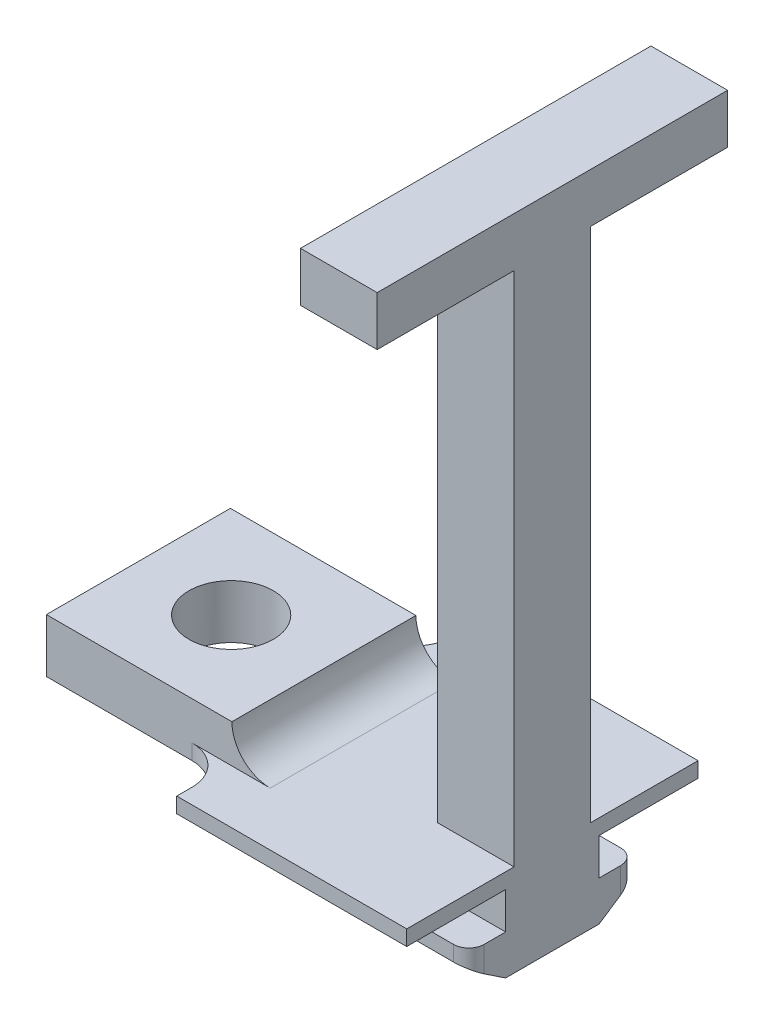
ISO-10303-21;
HEADER;
FILE_DESCRIPTION(('STEP AP214'),'2;1');
FILE_NAME('part.step','',(''),(''),'','','');
FILE_SCHEMA(('AUTOMOTIVE_DESIGN { 1 0 10303 214 1 1 1 1 }'));
ENDSEC;
DATA;
#1=APPLICATION_CONTEXT('core data for automotive mechanical design processes');
#2=APPLICATION_PROTOCOL_DEFINITION('international standard','automotive_design',2000,#1);
#3=PRODUCT_CONTEXT('',#1,'mechanical');
#4=PRODUCT('Part','Part','',(#3));
#5=PRODUCT_RELATED_PRODUCT_CATEGORY('part','',(#4));
#6=PRODUCT_DEFINITION_FORMATION('','',#4);
#7=PRODUCT_DEFINITION_CONTEXT('part definition',#1,'design');
#8=PRODUCT_DEFINITION('design','',#6,#7);
#9=PRODUCT_DEFINITION_SHAPE('','',#8);
#10=(LENGTH_UNIT() NAMED_UNIT(*) SI_UNIT(.MILLI.,.METRE.));
#11=(NAMED_UNIT(*) PLANE_ANGLE_UNIT() SI_UNIT($,.RADIAN.));
#12=(NAMED_UNIT(*) SI_UNIT($,.STERADIAN.) SOLID_ANGLE_UNIT());
#13=UNCERTAINTY_MEASURE_WITH_UNIT(LENGTH_MEASURE(1.E-05),#10,'distance_accuracy_value','');
#14=(GEOMETRIC_REPRESENTATION_CONTEXT(3) GLOBAL_UNCERTAINTY_ASSIGNED_CONTEXT((#13)) GLOBAL_UNIT_ASSIGNED_CONTEXT((#10,
#11,#12)) REPRESENTATION_CONTEXT('',''));
#15=CARTESIAN_POINT('',(0.,0.,0.));
#16=DIRECTION('',(0.,0.,1.));
#17=DIRECTION('',(1.,0.,0.));
#18=AXIS2_PLACEMENT_3D('',#15,#16,#17);
#19=CARTESIAN_POINT('',(-15.,0.,0.));
#20=DIRECTION('',(-1.,0.,0.));
#21=DIRECTION('',(0.,0.,1.));
#22=AXIS2_PLACEMENT_3D('',#19,#20,#21);
#23=PLANE('',#22);
#24=DIRECTION('',(0.,0.,1.));
#25=VECTOR('',#24,1.);
#26=CARTESIAN_POINT('',(-15.,-35.287280409727,9.50000000000001));
#27=LINE('',#26,#25);
#28=CARTESIAN_POINT('',(-15.,-35.287280409727,8.5));
#29=VERTEX_POINT('',#28);
#30=CARTESIAN_POINT('',(-15.,-35.287280409727,9.50000000000001));
#31=VERTEX_POINT('',#30);
#32=EDGE_CURVE('E289',#29,#31,#27,.T.);
#33=ORIENTED_EDGE('',*,*,#32,.F.);
#34=DIRECTION('',(0.,1.,0.));
#35=VECTOR('',#34,1.);
#36=CARTESIAN_POINT('',(-15.,-36.287280409727,8.5));
#37=LINE('',#36,#35);
#38=CARTESIAN_POINT('',(-15.,-36.287280409727,8.5));
#39=VERTEX_POINT('',#38);
#40=EDGE_CURVE('E479',#29,#39,#37,.F.);
#41=ORIENTED_EDGE('',*,*,#40,.T.);
#42=DIRECTION('',(0.,0.,-1.));
#43=VECTOR('',#42,1.);
#44=CARTESIAN_POINT('',(-15.,-36.287280409727,3.05));
#45=LINE('',#44,#43);
#46=CARTESIAN_POINT('',(-15.,-36.287280409727,9.5));
#47=VERTEX_POINT('',#46);
#48=EDGE_CURVE('E292',#47,#39,#45,.T.);
#49=ORIENTED_EDGE('',*,*,#48,.F.);
#50=DIRECTION('',(0.,-1.,0.));
#51=VECTOR('',#50,1.);
#52=CARTESIAN_POINT('',(-15.,-36.287280409727,9.5));
#53=LINE('',#52,#51);
#54=EDGE_CURVE('E288',#31,#47,#53,.T.);
#55=ORIENTED_EDGE('',*,*,#54,.F.);
#56=EDGE_LOOP('',(#33,#41,#49,#55));
#57=FACE_BOUND('',#56,.T.);
#58=ADVANCED_FACE('F35',(#57),#23,.T.);
#59=DIRECTION('',(0.,0.,1.));
#60=VECTOR('',#59,1.);
#61=CARTESIAN_POINT('',(-15.,-36.287280409727,0.));
#62=LINE('',#61,#60);
#63=CARTESIAN_POINT('',(-15.,-36.287280409727,-3.05));
#64=VERTEX_POINT('',#63);
#65=CARTESIAN_POINT('',(-15.,-36.287280409727,3.05));
#66=VERTEX_POINT('',#65);
#67=EDGE_CURVE('E469',#64,#66,#62,.T.);
#68=ORIENTED_EDGE('',*,*,#67,.F.);
#69=DIRECTION('',(0.,1.,0.));
#70=VECTOR('',#69,1.);
#71=CARTESIAN_POINT('',(-15.,-36.287280409727,-3.05));
#72=LINE('',#71,#70);
#73=CARTESIAN_POINT('',(-15.,-38.687280409727,-3.05));
#74=VERTEX_POINT('',#73);
#75=EDGE_CURVE('E319',#74,#64,#72,.T.);
#76=ORIENTED_EDGE('',*,*,#75,.F.);
#77=DIRECTION('',(0.,0.,1.));
#78=VECTOR('',#77,1.);
#79=CARTESIAN_POINT('',(-15.,-38.687280409727,-3.05));
#80=LINE('',#79,#78);
#81=CARTESIAN_POINT('',(-15.,-38.687280409727,-5.45));
#82=VERTEX_POINT('',#81);
#83=EDGE_CURVE('E316',#82,#74,#80,.T.);
#84=ORIENTED_EDGE('',*,*,#83,.F.);
#85=DIRECTION('',(0.,1.,0.));
#86=VECTOR('',#85,1.);
#87=CARTESIAN_POINT('',(-15.,-38.687280409727,-5.45));
#88=LINE('',#87,#86);
#89=CARTESIAN_POINT('',(-15.,-39.687280409727,-5.45));
#90=VERTEX_POINT('',#89);
#91=EDGE_CURVE('E313',#90,#82,#88,.T.);
#92=ORIENTED_EDGE('',*,*,#91,.F.);
#93=DIRECTION('',(0.,0.55470019622523,-0.832050294337843));
#94=VECTOR('',#93,1.);
#95=CARTESIAN_POINT('',(-15.,-39.687280409727,-5.45));
#96=LINE('',#95,#94);
#97=CARTESIAN_POINT('',(-15.,-41.287280409727,-3.05));
#98=VERTEX_POINT('',#97);
#99=EDGE_CURVE('E310',#98,#90,#96,.T.);
#100=ORIENTED_EDGE('',*,*,#99,.F.);
#101=DIRECTION('',(0.,0.,-1.));
#102=VECTOR('',#101,1.);
#103=CARTESIAN_POINT('',(-15.,-41.287280409727,-3.05));
#104=LINE('',#103,#102);
#105=CARTESIAN_POINT('',(-15.,-41.287280409727,3.05));
#106=VERTEX_POINT('',#105);
#107=EDGE_CURVE('E307',#106,#98,#104,.T.);
#108=ORIENTED_EDGE('',*,*,#107,.F.);
#109=DIRECTION('',(0.,-0.554700196225229,-0.832050294337844));
#110=VECTOR('',#109,1.);
#111=CARTESIAN_POINT('',(-15.,-39.687280409727,5.45));
#112=LINE('',#111,#110);
#113=CARTESIAN_POINT('',(-15.,-39.687280409727,5.45));
#114=VERTEX_POINT('',#113);
#115=EDGE_CURVE('E304',#114,#106,#112,.T.);
#116=ORIENTED_EDGE('',*,*,#115,.F.);
#117=DIRECTION('',(0.,-1.,0.));
#118=VECTOR('',#117,1.);
#119=CARTESIAN_POINT('',(-15.,-38.687280409727,5.45));
#120=LINE('',#119,#118);
#121=CARTESIAN_POINT('',(-15.,-38.687280409727,5.45));
#122=VERTEX_POINT('',#121);
#123=EDGE_CURVE('E301',#122,#114,#120,.T.);
#124=ORIENTED_EDGE('',*,*,#123,.F.);
#125=DIRECTION('',(0.,0.,1.));
#126=VECTOR('',#125,1.);
#127=CARTESIAN_POINT('',(-15.,-38.687280409727,3.05));
#128=LINE('',#127,#126);
#129=CARTESIAN_POINT('',(-15.,-38.687280409727,3.05));
#130=VERTEX_POINT('',#129);
#131=EDGE_CURVE('E298',#130,#122,#128,.T.);
#132=ORIENTED_EDGE('',*,*,#131,.F.);
#133=DIRECTION('',(0.,-1.,0.));
#134=VECTOR('',#133,1.);
#135=CARTESIAN_POINT('',(-15.,-36.287280409727,3.05));
#136=LINE('',#135,#134);
#137=EDGE_CURVE('E295',#66,#130,#136,.T.);
#138=ORIENTED_EDGE('',*,*,#137,.F.);
#139=EDGE_LOOP('',(#68,#76,#84,#92,#100,#108,#116,#124,#132,#138));
#140=FACE_BOUND('',#139,.T.);
#141=ADVANCED_FACE('F557',(#140),#23,.T.);
#142=CARTESIAN_POINT('',(-5.,-1.61020370688902,11.4271991646471));
#143=DIRECTION('',(0.,-1.,0.));
#144=DIRECTION('',(0.,0.,-1.));
#145=AXIS2_PLACEMENT_3D('',#142,#143,#144);
#146=PLANE('',#145);
#147=DIRECTION('',(1.,0.,0.));
#148=VECTOR('',#147,1.);
#149=CARTESIAN_POINT('',(-5.,-1.61020370688902,-2.49999999999999));
#150=LINE('',#149,#148);
#151=CARTESIAN_POINT('',(-5.,-1.61020370688902,-2.49999999999999));
#152=VERTEX_POINT('',#151);
#153=CARTESIAN_POINT('',(0.,-1.61020370688902,-2.49999999999999));
#154=VERTEX_POINT('',#153);
#155=EDGE_CURVE('E412',#152,#154,#150,.T.);
#156=ORIENTED_EDGE('',*,*,#155,.F.);
#157=DIRECTION('',(0.,0.,-1.));
#158=VECTOR('',#157,1.);
#159=CARTESIAN_POINT('',(-5.,-1.61020370688902,11.4271991646471));
#160=LINE('',#159,#158);
#161=CARTESIAN_POINT('',(-5.,-1.61020370688902,-11.4271991646471));
#162=VERTEX_POINT('',#161);
#163=EDGE_CURVE('E420',#152,#162,#160,.T.);
#164=ORIENTED_EDGE('',*,*,#163,.T.);
#165=DIRECTION('',(1.,0.,0.));
#166=VECTOR('',#165,1.);
#167=CARTESIAN_POINT('',(-5.,-1.61020370688902,-11.4271991646471));
#168=LINE('',#167,#166);
#169=CARTESIAN_POINT('',(0.,-1.61020370688902,-11.4271991646471));
#170=VERTEX_POINT('',#169);
#171=EDGE_CURVE('E428',#162,#170,#168,.T.);
#172=ORIENTED_EDGE('',*,*,#171,.T.);
#173=DIRECTION('',(0.,0.,-1.));
#174=VECTOR('',#173,1.);
#175=CARTESIAN_POINT('',(0.,-1.61020370688902,11.4271991646471));
#176=LINE('',#175,#174);
#177=EDGE_CURVE('E415',#154,#170,#176,.T.);
#178=ORIENTED_EDGE('',*,*,#177,.F.);
#179=EDGE_LOOP('',(#156,#164,#172,#178));
#180=FACE_BOUND('',#179,.T.);
#181=ADVANCED_FACE('F591',(#180),#146,.T.);
#182=DIRECTION('',(-1.,0.,0.));
#183=VECTOR('',#182,1.);
#184=CARTESIAN_POINT('',(-5.,-1.61020370688902,2.5));
#185=LINE('',#184,#183);
#186=CARTESIAN_POINT('',(0.,-1.61020370688902,2.5));
#187=VERTEX_POINT('',#186);
#188=CARTESIAN_POINT('',(-5.,-1.61020370688902,2.5));
#189=VERTEX_POINT('',#188);
#190=EDGE_CURVE('E407',#187,#189,#185,.T.);
#191=ORIENTED_EDGE('',*,*,#190,.F.);
#192=CARTESIAN_POINT('',(0.,-1.61020370688902,11.4271991646471));
#193=VERTEX_POINT('',#192);
#194=EDGE_CURVE('E429',#193,#187,#176,.T.);
#195=ORIENTED_EDGE('',*,*,#194,.F.);
#196=DIRECTION('',(1.,0.,0.));
#197=VECTOR('',#196,1.);
#198=CARTESIAN_POINT('',(-5.,-1.61020370688902,11.4271991646471));
#199=LINE('',#198,#197);
#200=CARTESIAN_POINT('',(-5.,-1.61020370688902,11.4271991646471));
#201=VERTEX_POINT('',#200);
#202=EDGE_CURVE('E440',#201,#193,#199,.T.);
#203=ORIENTED_EDGE('',*,*,#202,.F.);
#204=EDGE_CURVE('E416',#201,#189,#160,.T.);
#205=ORIENTED_EDGE('',*,*,#204,.T.);
#206=EDGE_LOOP('',(#191,#195,#203,#205));
#207=FACE_BOUND('',#206,.T.);
#208=ADVANCED_FACE('F521',(#207),#146,.T.);
#209=CARTESIAN_POINT('',(-5.,1.61020370688902,11.4271991646471));
#210=DIRECTION('',(0.,0.,1.));
#211=DIRECTION('',(1.,0.,0.));
#212=AXIS2_PLACEMENT_3D('',#209,#210,#211);
#213=PLANE('',#212);
#214=DIRECTION('',(0.,-1.,0.));
#215=VECTOR('',#214,1.);
#216=CARTESIAN_POINT('',(0.,1.61020370688902,11.4271991646471));
#217=LINE('',#216,#215);
#218=CARTESIAN_POINT('',(0.,1.61020370688902,11.4271991646471));
#219=VERTEX_POINT('',#218);
#220=EDGE_CURVE('E437',#219,#193,#217,.T.);
#221=ORIENTED_EDGE('',*,*,#220,.F.);
#222=DIRECTION('',(1.,0.,0.));
#223=VECTOR('',#222,1.);
#224=CARTESIAN_POINT('',(-5.,1.61020370688902,11.4271991646471));
#225=LINE('',#224,#223);
#226=CARTESIAN_POINT('',(-5.,1.61020370688902,11.4271991646471));
#227=VERTEX_POINT('',#226);
#228=EDGE_CURVE('E443',#227,#219,#225,.T.);
#229=ORIENTED_EDGE('',*,*,#228,.F.);
#230=DIRECTION('',(0.,-1.,0.));
#231=VECTOR('',#230,1.);
#232=CARTESIAN_POINT('',(-5.,1.61020370688902,11.4271991646471));
#233=LINE('',#232,#231);
#234=EDGE_CURVE('E425',#227,#201,#233,.T.);
#235=ORIENTED_EDGE('',*,*,#234,.T.);
#236=ORIENTED_EDGE('',*,*,#202,.T.);
#237=EDGE_LOOP('',(#221,#229,#235,#236));
#238=FACE_BOUND('',#237,.T.);
#239=ADVANCED_FACE('F616',(#238),#213,.T.);
#240=CARTESIAN_POINT('',(-5.,1.61020370688902,11.4271991646471));
#241=DIRECTION('',(0.,-1.,0.));
#242=DIRECTION('',(0.,0.,-1.));
#243=AXIS2_PLACEMENT_3D('',#240,#241,#242);
#244=PLANE('',#243);
#245=DIRECTION('',(0.,0.,-1.));
#246=VECTOR('',#245,1.);
#247=CARTESIAN_POINT('',(0.,1.61020370688902,11.4271991646471));
#248=LINE('',#247,#246);
#249=CARTESIAN_POINT('',(0.,1.61020370688902,-11.4271991646471));
#250=VERTEX_POINT('',#249);
#251=EDGE_CURVE('E435',#219,#250,#248,.T.);
#252=ORIENTED_EDGE('',*,*,#251,.T.);
#253=DIRECTION('',(1.,0.,0.));
#254=VECTOR('',#253,1.);
#255=CARTESIAN_POINT('',(-5.,1.61020370688902,-11.4271991646471));
#256=LINE('',#255,#254);
#257=CARTESIAN_POINT('',(-5.,1.61020370688902,-11.4271991646471));
#258=VERTEX_POINT('',#257);
#259=EDGE_CURVE('E445',#258,#250,#256,.T.);
#260=ORIENTED_EDGE('',*,*,#259,.F.);
#261=DIRECTION('',(0.,0.,-1.));
#262=VECTOR('',#261,1.);
#263=CARTESIAN_POINT('',(-5.,1.61020370688902,11.4271991646471));
#264=LINE('',#263,#262);
#265=EDGE_CURVE('E423',#227,#258,#264,.T.);
#266=ORIENTED_EDGE('',*,*,#265,.F.);
#267=ORIENTED_EDGE('',*,*,#228,.T.);
#268=EDGE_LOOP('',(#252,#260,#266,#267));
#269=FACE_BOUND('',#268,.T.);
#270=ADVANCED_FACE('F619',(#269),#244,.F.);
#271=CARTESIAN_POINT('',(-5.,1.61020370688902,-11.4271991646471));
#272=DIRECTION('',(0.,0.,1.));
#273=DIRECTION('',(0.,-1.,0.));
#274=AXIS2_PLACEMENT_3D('',#271,#272,#273);
#275=PLANE('',#274);
#276=DIRECTION('',(0.,-1.,0.));
#277=VECTOR('',#276,1.);
#278=CARTESIAN_POINT('',(0.,1.61020370688902,-11.4271991646471));
#279=LINE('',#278,#277);
#280=EDGE_CURVE('E432',#250,#170,#279,.T.);
#281=ORIENTED_EDGE('',*,*,#280,.T.);
#282=ORIENTED_EDGE('',*,*,#171,.F.);
#283=DIRECTION('',(0.,-1.,0.));
#284=VECTOR('',#283,1.);
#285=CARTESIAN_POINT('',(-5.,1.61020370688902,-11.4271991646471));
#286=LINE('',#285,#284);
#287=EDGE_CURVE('E419',#258,#162,#286,.T.);
#288=ORIENTED_EDGE('',*,*,#287,.F.);
#289=ORIENTED_EDGE('',*,*,#259,.T.);
#290=EDGE_LOOP('',(#281,#282,#288,#289));
#291=FACE_BOUND('',#290,.T.);
#292=ADVANCED_FACE('F613',(#291),#275,.F.);
#293=CARTESIAN_POINT('',(-5.,0.,0.));
#294=DIRECTION('',(-1.,0.,0.));
#295=DIRECTION('',(0.,0.,1.));
#296=AXIS2_PLACEMENT_3D('',#293,#294,#295);
#297=PLANE('',#296);
#298=DIRECTION('',(0.,0.,-1.));
#299=VECTOR('',#298,1.);
#300=CARTESIAN_POINT('',(-5.,-35.287280409727,0.));
#301=LINE('',#300,#299);
#302=CARTESIAN_POINT('',(-5.,-35.287280409727,2.5));
#303=VERTEX_POINT('',#302);
#304=CARTESIAN_POINT('',(-5.,-35.287280409727,-2.5));
#305=VERTEX_POINT('',#304);
#306=EDGE_CURVE('E364',#303,#305,#301,.T.);
#307=ORIENTED_EDGE('',*,*,#306,.F.);
#308=DIRECTION('',(0.,-1.,0.));
#309=VECTOR('',#308,1.);
#310=CARTESIAN_POINT('',(-5.,-36.287280409727,2.5));
#311=LINE('',#310,#309);
#312=EDGE_CURVE('E403',#189,#303,#311,.T.);
#313=ORIENTED_EDGE('',*,*,#312,.F.);
#314=ORIENTED_EDGE('',*,*,#204,.F.);
#315=ORIENTED_EDGE('',*,*,#234,.F.);
#316=ORIENTED_EDGE('',*,*,#265,.T.);
#317=ORIENTED_EDGE('',*,*,#287,.T.);
#318=ORIENTED_EDGE('',*,*,#163,.F.);
#319=DIRECTION('',(0.,1.,0.));
#320=VECTOR('',#319,1.);
#321=CARTESIAN_POINT('',(-5.,-36.287280409727,-2.5));
#322=LINE('',#321,#320);
#323=EDGE_CURVE('E401',#305,#152,#322,.T.);
#324=ORIENTED_EDGE('',*,*,#323,.F.);
#325=EDGE_LOOP('',(#307,#313,#314,#315,#316,#317,#318,#324));
#326=FACE_BOUND('',#325,.T.);
#327=ADVANCED_FACE('F524',(#326),#297,.T.);
#328=CARTESIAN_POINT('',(0.,0.,0.));
#329=DIRECTION('',(-1.,0.,0.));
#330=DIRECTION('',(0.,0.,1.));
#331=AXIS2_PLACEMENT_3D('',#328,#329,#330);
#332=PLANE('',#331);
#333=DIRECTION('',(0.,0.,1.));
#334=VECTOR('',#333,1.);
#335=CARTESIAN_POINT('',(0.,-38.687280409727,3.05));
#336=LINE('',#335,#334);
#337=CARTESIAN_POINT('',(0.,-38.687280409727,3.05));
#338=VERTEX_POINT('',#337);
#339=CARTESIAN_POINT('',(0.,-38.687280409727,4.45));
#340=VERTEX_POINT('',#339);
#341=EDGE_CURVE('E340',#338,#340,#336,.T.);
#342=ORIENTED_EDGE('',*,*,#341,.T.);
#343=DIRECTION('',(0.,-1.,0.));
#344=VECTOR('',#343,1.);
#345=CARTESIAN_POINT('',(0.,-39.687280409727,4.45));
#346=LINE('',#345,#344);
#347=CARTESIAN_POINT('',(0.,-40.3539470763937,4.44999999999999));
#348=VERTEX_POINT('',#347);
#349=EDGE_CURVE('E454',#340,#348,#346,.T.);
#350=ORIENTED_EDGE('',*,*,#349,.T.);
#351=DIRECTION('',(0.,-0.554700196225229,-0.832050294337844));
#352=VECTOR('',#351,1.);
#353=CARTESIAN_POINT('',(0.,-39.687280409727,5.45));
#354=LINE('',#353,#352);
#355=CARTESIAN_POINT('',(0.,-41.287280409727,3.05));
#356=VERTEX_POINT('',#355);
#357=EDGE_CURVE('E343',#348,#356,#354,.T.);
#358=ORIENTED_EDGE('',*,*,#357,.T.);
#359=DIRECTION('',(0.,0.,-1.));
#360=VECTOR('',#359,1.);
#361=CARTESIAN_POINT('',(0.,-41.287280409727,-3.05));
#362=LINE('',#361,#360);
#363=CARTESIAN_POINT('',(0.,-41.287280409727,-3.05));
#364=VERTEX_POINT('',#363);
#365=EDGE_CURVE('E345',#356,#364,#362,.T.);
#366=ORIENTED_EDGE('',*,*,#365,.T.);
#367=DIRECTION('',(0.,0.55470019622523,-0.832050294337843));
#368=VECTOR('',#367,1.);
#369=CARTESIAN_POINT('',(0.,-39.687280409727,-5.45));
#370=LINE('',#369,#368);
#371=CARTESIAN_POINT('',(0.,-40.3539470763937,-4.45));
#372=VERTEX_POINT('',#371);
#373=EDGE_CURVE('E348',#364,#372,#370,.T.);
#374=ORIENTED_EDGE('',*,*,#373,.T.);
#375=DIRECTION('',(0.,1.,0.));
#376=VECTOR('',#375,1.);
#377=CARTESIAN_POINT('',(0.,-38.687280409727,-4.45));
#378=LINE('',#377,#376);
#379=CARTESIAN_POINT('',(0.,-38.687280409727,-4.45));
#380=VERTEX_POINT('',#379);
#381=EDGE_CURVE('E451',#372,#380,#378,.T.);
#382=ORIENTED_EDGE('',*,*,#381,.T.);
#383=DIRECTION('',(0.,0.,1.));
#384=VECTOR('',#383,1.);
#385=CARTESIAN_POINT('',(0.,-38.687280409727,-3.05));
#386=LINE('',#385,#384);
#387=CARTESIAN_POINT('',(0.,-38.687280409727,-3.05));
#388=VERTEX_POINT('',#387);
#389=EDGE_CURVE('E351',#380,#388,#386,.T.);
#390=ORIENTED_EDGE('',*,*,#389,.T.);
#391=DIRECTION('',(0.,1.,0.));
#392=VECTOR('',#391,1.);
#393=CARTESIAN_POINT('',(0.,-36.287280409727,-3.05));
#394=LINE('',#393,#392);
#395=CARTESIAN_POINT('',(0.,-36.287280409727,-3.05));
#396=VERTEX_POINT('',#395);
#397=EDGE_CURVE('E353',#388,#396,#394,.T.);
#398=ORIENTED_EDGE('',*,*,#397,.T.);
#399=DIRECTION('',(0.,0.,-1.));
#400=VECTOR('',#399,1.);
#401=CARTESIAN_POINT('',(0.,-36.287280409727,-3.05));
#402=LINE('',#401,#400);
#403=CARTESIAN_POINT('',(0.,-36.287280409727,-9.5));
#404=VERTEX_POINT('',#403);
#405=EDGE_CURVE('E356',#396,#404,#402,.T.);
#406=ORIENTED_EDGE('',*,*,#405,.T.);
#407=DIRECTION('',(0.,1.,0.));
#408=VECTOR('',#407,1.);
#409=CARTESIAN_POINT('',(0.,-35.287280409727,-9.5));
#410=LINE('',#409,#408);
#411=CARTESIAN_POINT('',(0.,-35.287280409727,-9.5));
#412=VERTEX_POINT('',#411);
#413=EDGE_CURVE('E359',#404,#412,#410,.T.);
#414=ORIENTED_EDGE('',*,*,#413,.T.);
#415=DIRECTION('',(0.,0.,1.));
#416=VECTOR('',#415,1.);
#417=CARTESIAN_POINT('',(0.,-35.287280409727,9.50000000000001));
#418=LINE('',#417,#416);
#419=CARTESIAN_POINT('',(0.,-35.287280409727,-2.5));
#420=VERTEX_POINT('',#419);
#421=EDGE_CURVE('E328',#412,#420,#418,.T.);
#422=ORIENTED_EDGE('',*,*,#421,.T.);
#423=DIRECTION('',(0.,1.,0.));
#424=VECTOR('',#423,1.);
#425=CARTESIAN_POINT('',(0.,-36.287280409727,-2.5));
#426=LINE('',#425,#424);
#427=EDGE_CURVE('E400',#420,#154,#426,.T.);
#428=ORIENTED_EDGE('',*,*,#427,.T.);
#429=ORIENTED_EDGE('',*,*,#177,.T.);
#430=ORIENTED_EDGE('',*,*,#280,.F.);
#431=ORIENTED_EDGE('',*,*,#251,.F.);
#432=ORIENTED_EDGE('',*,*,#220,.T.);
#433=ORIENTED_EDGE('',*,*,#194,.T.);
#434=DIRECTION('',(0.,-1.,0.));
#435=VECTOR('',#434,1.);
#436=CARTESIAN_POINT('',(0.,-36.287280409727,2.5));
#437=LINE('',#436,#435);
#438=CARTESIAN_POINT('',(0.,-35.287280409727,2.5));
#439=VERTEX_POINT('',#438);
#440=EDGE_CURVE('E404',#187,#439,#437,.T.);
#441=ORIENTED_EDGE('',*,*,#440,.T.);
#442=CARTESIAN_POINT('',(0.,-35.287280409727,9.50000000000001));
#443=VERTEX_POINT('',#442);
#444=EDGE_CURVE('E284',#439,#443,#418,.T.);
#445=ORIENTED_EDGE('',*,*,#444,.T.);
#446=DIRECTION('',(0.,-1.,0.));
#447=VECTOR('',#446,1.);
#448=CARTESIAN_POINT('',(0.,-36.287280409727,9.5));
#449=LINE('',#448,#447);
#450=CARTESIAN_POINT('',(0.,-36.287280409727,9.5));
#451=VERTEX_POINT('',#450);
#452=EDGE_CURVE('E331',#443,#451,#449,.T.);
#453=ORIENTED_EDGE('',*,*,#452,.T.);
#454=DIRECTION('',(0.,0.,-1.));
#455=VECTOR('',#454,1.);
#456=CARTESIAN_POINT('',(0.,-36.287280409727,3.05));
#457=LINE('',#456,#455);
#458=CARTESIAN_POINT('',(0.,-36.287280409727,3.05));
#459=VERTEX_POINT('',#458);
#460=EDGE_CURVE('E334',#451,#459,#457,.T.);
#461=ORIENTED_EDGE('',*,*,#460,.T.);
#462=DIRECTION('',(0.,-1.,0.));
#463=VECTOR('',#462,1.);
#464=CARTESIAN_POINT('',(0.,-36.287280409727,3.05));
#465=LINE('',#464,#463);
#466=EDGE_CURVE('E337',#459,#338,#465,.T.);
#467=ORIENTED_EDGE('',*,*,#466,.T.);
#468=EDGE_LOOP('',(#342,#350,#358,#366,#374,#382,#390,#398,#406,#414,#422,#428,#429,#430,#431,
#432,#433,#441,#445,#453,#461,#467));
#469=FACE_BOUND('',#468,.T.);
#470=ADVANCED_FACE('F516',(#469),#332,.F.);
#471=CARTESIAN_POINT('',(-5.,-36.287280409727,-2.5));
#472=DIRECTION('',(0.,0.,-1.));
#473=DIRECTION('',(0.,1.,0.));
#474=AXIS2_PLACEMENT_3D('',#471,#472,#473);
#475=PLANE('',#474);
#476=DIRECTION('',(1.,0.,0.));
#477=VECTOR('',#476,1.);
#478=CARTESIAN_POINT('',(-5.,-35.287280409727,-2.5));
#479=LINE('',#478,#477);
#480=EDGE_CURVE('E398',#305,#420,#479,.T.);
#481=ORIENTED_EDGE('',*,*,#480,.F.);
#482=ORIENTED_EDGE('',*,*,#323,.T.);
#483=ORIENTED_EDGE('',*,*,#155,.T.);
#484=ORIENTED_EDGE('',*,*,#427,.F.);
#485=EDGE_LOOP('',(#481,#482,#483,#484));
#486=FACE_BOUND('',#485,.T.);
#487=ADVANCED_FACE('F532',(#486),#475,.T.);
#488=CARTESIAN_POINT('',(-5.,-36.287280409727,2.5));
#489=DIRECTION('',(0.,0.,1.));
#490=DIRECTION('',(0.,-1.,0.));
#491=AXIS2_PLACEMENT_3D('',#488,#489,#490);
#492=PLANE('',#491);
#493=DIRECTION('',(-1.,0.,0.));
#494=VECTOR('',#493,1.);
#495=CARTESIAN_POINT('',(-5.,-35.287280409727,2.5));
#496=LINE('',#495,#494);
#497=EDGE_CURVE('E442',#439,#303,#496,.T.);
#498=ORIENTED_EDGE('',*,*,#497,.F.);
#499=ORIENTED_EDGE('',*,*,#440,.F.);
#500=ORIENTED_EDGE('',*,*,#190,.T.);
#501=ORIENTED_EDGE('',*,*,#312,.T.);
#502=EDGE_LOOP('',(#498,#499,#500,#501));
#503=FACE_BOUND('',#502,.T.);
#504=ADVANCED_FACE('F513',(#503),#492,.T.);
#505=CARTESIAN_POINT('',(-15.,-35.287280409727,9.50000000000001));
#506=DIRECTION('',(0.,1.,0.));
#507=DIRECTION('',(0.,0.,1.));
#508=AXIS2_PLACEMENT_3D('',#505,#506,#507);
#509=PLANE('',#508);
#510=DIRECTION('',(0.,0.,1.));
#511=VECTOR('',#510,1.);
#512=CARTESIAN_POINT('',(-12.4,-35.287280409727,9.50000000000001));
#513=LINE('',#512,#511);
#514=CARTESIAN_POINT('',(-12.4,-35.287280409727,-6.));
#515=VERTEX_POINT('',#514);
#516=CARTESIAN_POINT('',(-12.4,-35.287280409727,6.));
#517=VERTEX_POINT('',#516);
#518=EDGE_CURVE('E481',#515,#517,#513,.T.);
#519=ORIENTED_EDGE('',*,*,#518,.T.);
#520=DIRECTION('',(1.,0.,0.));
#521=VECTOR('',#520,1.);
#522=CARTESIAN_POINT('',(-15.,-35.287280409727,6.));
#523=LINE('',#522,#521);
#524=CARTESIAN_POINT('',(-17.5,-35.287280409727,6.));
#525=VERTEX_POINT('',#524);
#526=EDGE_CURVE('E50',#525,#517,#523,.T.);
#527=ORIENTED_EDGE('',*,*,#526,.F.);
#528=CARTESIAN_POINT('',(-17.5,-35.287280409727,8.5));
#529=DIRECTION('',(0.,1.,0.));
#530=DIRECTION('',(0.,0.,1.));
#531=AXIS2_PLACEMENT_3D('',#528,#529,#530);
#532=CIRCLE('',#531,2.5);
#533=EDGE_CURVE('E487',#525,#29,#532,.F.);
#534=ORIENTED_EDGE('',*,*,#533,.T.);
#535=ORIENTED_EDGE('',*,*,#32,.T.);
#536=DIRECTION('',(1.,0.,0.));
#537=VECTOR('',#536,1.);
#538=CARTESIAN_POINT('',(-15.,-35.287280409727,9.50000000000001));
#539=LINE('',#538,#537);
#540=EDGE_CURVE('E327',#31,#443,#539,.T.);
#541=ORIENTED_EDGE('',*,*,#540,.T.);
#542=ORIENTED_EDGE('',*,*,#444,.F.);
#543=ORIENTED_EDGE('',*,*,#497,.T.);
#544=ORIENTED_EDGE('',*,*,#306,.T.);
#545=ORIENTED_EDGE('',*,*,#480,.T.);
#546=ORIENTED_EDGE('',*,*,#421,.F.);
#547=DIRECTION('',(1.,0.,0.));
#548=VECTOR('',#547,1.);
#549=CARTESIAN_POINT('',(-15.,-35.287280409727,-9.5));
#550=LINE('',#549,#548);
#551=CARTESIAN_POINT('',(-15.,-35.287280409727,-9.5));
#552=VERTEX_POINT('',#551);
#553=EDGE_CURVE('E362',#552,#412,#550,.T.);
#554=ORIENTED_EDGE('',*,*,#553,.F.);
#555=CARTESIAN_POINT('',(-15.,-35.287280409727,-8.5));
#556=VERTEX_POINT('',#555);
#557=EDGE_CURVE('E285',#552,#556,#27,.T.);
#558=ORIENTED_EDGE('',*,*,#557,.T.);
#559=CARTESIAN_POINT('',(-17.5,-35.287280409727,-8.5));
#560=DIRECTION('',(0.,1.,0.));
#561=DIRECTION('',(0.,0.,1.));
#562=AXIS2_PLACEMENT_3D('',#559,#560,#561);
#563=CIRCLE('',#562,2.5);
#564=CARTESIAN_POINT('',(-17.5,-35.287280409727,-6.));
#565=VERTEX_POINT('',#564);
#566=EDGE_CURVE('E485',#556,#565,#563,.F.);
#567=ORIENTED_EDGE('',*,*,#566,.T.);
#568=DIRECTION('',(-1.,0.,0.));
#569=VECTOR('',#568,1.);
#570=CARTESIAN_POINT('',(-15.,-35.287280409727,-6.));
#571=LINE('',#570,#569);
#572=EDGE_CURVE('E58',#515,#565,#571,.T.);
#573=ORIENTED_EDGE('',*,*,#572,.F.);
#574=EDGE_LOOP('',(#519,#527,#534,#535,#541,#542,#543,#544,#545,#546,#554,#558,#567,#573));
#575=FACE_BOUND('',#574,.T.);
#576=ADVANCED_FACE('F501',(#575),#509,.T.);
#577=CARTESIAN_POINT('',(-15.,-35.287280409727,-9.5));
#578=DIRECTION('',(0.,0.,-1.));
#579=DIRECTION('',(-1.,0.,0.));
#580=AXIS2_PLACEMENT_3D('',#577,#578,#579);
#581=PLANE('',#580);
#582=ORIENTED_EDGE('',*,*,#413,.F.);
#583=DIRECTION('',(1.,0.,0.));
#584=VECTOR('',#583,1.);
#585=CARTESIAN_POINT('',(-15.,-36.287280409727,-9.5));
#586=LINE('',#585,#584);
#587=CARTESIAN_POINT('',(-15.,-36.287280409727,-9.5));
#588=VERTEX_POINT('',#587);
#589=EDGE_CURVE('E365',#588,#404,#586,.T.);
#590=ORIENTED_EDGE('',*,*,#589,.F.);
#591=DIRECTION('',(0.,1.,0.));
#592=VECTOR('',#591,1.);
#593=CARTESIAN_POINT('',(-15.,-35.287280409727,-9.5));
#594=LINE('',#593,#592);
#595=EDGE_CURVE('E324',#588,#552,#594,.T.);
#596=ORIENTED_EDGE('',*,*,#595,.T.);
#597=ORIENTED_EDGE('',*,*,#553,.T.);
#598=EDGE_LOOP('',(#582,#590,#596,#597));
#599=FACE_BOUND('',#598,.T.);
#600=ADVANCED_FACE('F546',(#599),#581,.T.);
#601=CARTESIAN_POINT('',(-15.,-36.287280409727,-3.05));
#602=DIRECTION('',(0.,-1.,0.));
#603=DIRECTION('',(0.,0.,-1.));
#604=AXIS2_PLACEMENT_3D('',#601,#602,#603);
#605=PLANE('',#604);
#606=CARTESIAN_POINT('',(-20.95,-36.287280409727,0.));
#607=DIRECTION('',(0.,-1.,0.));
#608=DIRECTION('',(0.,0.,-1.));
#609=AXIS2_PLACEMENT_3D('',#606,#607,#608);
#610=CIRCLE('',#609,2.75);
#611=CARTESIAN_POINT('',(-20.95,-36.287280409727,-2.74999999999999));
#612=VERTEX_POINT('',#611);
#613=EDGE_CURVE('E270',#612,#612,#610,.F.);
#614=ORIENTED_EDGE('',*,*,#613,.T.);
#615=EDGE_LOOP('',(#614));
#616=FACE_BOUND('',#615,.T.);
#617=DIRECTION('',(-1.,0.,0.));
#618=VECTOR('',#617,1.);
#619=CARTESIAN_POINT('',(-14.9,-36.287280409727,-6.));
#620=LINE('',#619,#618);
#621=CARTESIAN_POINT('',(-17.5,-36.287280409727,-6.));
#622=VERTEX_POINT('',#621);
#623=CARTESIAN_POINT('',(-27.,-36.287280409727,-6.));
#624=VERTEX_POINT('',#623);
#625=EDGE_CURVE('E279',#622,#624,#620,.T.);
#626=ORIENTED_EDGE('',*,*,#625,.F.);
#627=CARTESIAN_POINT('',(-17.5,-36.287280409727,-8.5));
#628=DIRECTION('',(0.,-1.,0.));
#629=DIRECTION('',(0.,0.,-1.));
#630=AXIS2_PLACEMENT_3D('',#627,#628,#629);
#631=CIRCLE('',#630,2.5);
#632=CARTESIAN_POINT('',(-15.,-36.287280409727,-8.5));
#633=VERTEX_POINT('',#632);
#634=EDGE_CURVE('E483',#622,#633,#631,.F.);
#635=ORIENTED_EDGE('',*,*,#634,.T.);
#636=DIRECTION('',(0.,0.,-1.));
#637=VECTOR('',#636,1.);
#638=CARTESIAN_POINT('',(-15.,-36.287280409727,-3.05));
#639=LINE('',#638,#637);
#640=EDGE_CURVE('E322',#633,#588,#639,.T.);
#641=ORIENTED_EDGE('',*,*,#640,.T.);
#642=ORIENTED_EDGE('',*,*,#589,.T.);
#643=ORIENTED_EDGE('',*,*,#405,.F.);
#644=DIRECTION('',(1.,0.,0.));
#645=VECTOR('',#644,1.);
#646=CARTESIAN_POINT('',(-15.,-36.287280409727,-3.05));
#647=LINE('',#646,#645);
#648=EDGE_CURVE('E367',#64,#396,#647,.T.);
#649=ORIENTED_EDGE('',*,*,#648,.F.);
#650=ORIENTED_EDGE('',*,*,#67,.T.);
#651=DIRECTION('',(1.,0.,0.));
#652=VECTOR('',#651,1.);
#653=CARTESIAN_POINT('',(-15.,-36.287280409727,3.05));
#654=LINE('',#653,#652);
#655=EDGE_CURVE('E391',#66,#459,#654,.T.);
#656=ORIENTED_EDGE('',*,*,#655,.T.);
#657=ORIENTED_EDGE('',*,*,#460,.F.);
#658=DIRECTION('',(1.,0.,0.));
#659=VECTOR('',#658,1.);
#660=CARTESIAN_POINT('',(-15.,-36.287280409727,9.5));
#661=LINE('',#660,#659);
#662=EDGE_CURVE('E393',#47,#451,#661,.T.);
#663=ORIENTED_EDGE('',*,*,#662,.F.);
#664=ORIENTED_EDGE('',*,*,#48,.T.);
#665=CARTESIAN_POINT('',(-17.5,-36.287280409727,8.5));
#666=DIRECTION('',(0.,-1.,0.));
#667=DIRECTION('',(0.,0.,-1.));
#668=AXIS2_PLACEMENT_3D('',#665,#666,#667);
#669=CIRCLE('',#668,2.5);
#670=CARTESIAN_POINT('',(-17.5,-36.287280409727,6.));
#671=VERTEX_POINT('',#670);
#672=EDGE_CURVE('E489',#39,#671,#669,.F.);
#673=ORIENTED_EDGE('',*,*,#672,.T.);
#674=DIRECTION('',(-1.,0.,0.));
#675=VECTOR('',#674,1.);
#676=CARTESIAN_POINT('',(-14.9,-36.287280409727,6.));
#677=LINE('',#676,#675);
#678=CARTESIAN_POINT('',(-27.,-36.287280409727,6.));
#679=VERTEX_POINT('',#678);
#680=EDGE_CURVE('E277',#671,#679,#677,.T.);
#681=ORIENTED_EDGE('',*,*,#680,.T.);
#682=DIRECTION('',(0.,0.,1.));
#683=VECTOR('',#682,1.);
#684=CARTESIAN_POINT('',(-27.,-36.287280409727,-6.));
#685=LINE('',#684,#683);
#686=EDGE_CURVE('E266',#624,#679,#685,.T.);
#687=ORIENTED_EDGE('',*,*,#686,.F.);
#688=EDGE_LOOP('',(#626,#635,#641,#642,#643,#649,#650,#656,#657,#663,#664,#673,#681,#687));
#689=FACE_BOUND('',#688,.T.);
#690=ADVANCED_FACE('F493',(#616,#689),#605,.T.);
#691=CARTESIAN_POINT('',(-15.,-36.287280409727,-3.05));
#692=DIRECTION('',(0.,0.,-1.));
#693=DIRECTION('',(0.,1.,0.));
#694=AXIS2_PLACEMENT_3D('',#691,#692,#693);
#695=PLANE('',#694);
#696=ORIENTED_EDGE('',*,*,#397,.F.);
#697=DIRECTION('',(1.,0.,0.));
#698=VECTOR('',#697,1.);
#699=CARTESIAN_POINT('',(-15.,-38.687280409727,-3.05));
#700=LINE('',#699,#698);
#701=EDGE_CURVE('E369',#74,#388,#700,.T.);
#702=ORIENTED_EDGE('',*,*,#701,.F.);
#703=ORIENTED_EDGE('',*,*,#75,.T.);
#704=ORIENTED_EDGE('',*,*,#648,.T.);
#705=EDGE_LOOP('',(#696,#702,#703,#704));
#706=FACE_BOUND('',#705,.T.);
#707=ADVANCED_FACE('F552',(#706),#695,.T.);
#708=CARTESIAN_POINT('',(-15.,-38.687280409727,-3.05));
#709=DIRECTION('',(0.,1.,0.));
#710=DIRECTION('',(0.,0.,1.));
#711=AXIS2_PLACEMENT_3D('',#708,#709,#710);
#712=PLANE('',#711);
#713=ORIENTED_EDGE('',*,*,#389,.F.);
#714=CARTESIAN_POINT('',(-1.,-38.687280409727,-4.45));
#715=DIRECTION('',(0.,1.,0.));
#716=DIRECTION('',(0.,0.,1.));
#717=AXIS2_PLACEMENT_3D('',#714,#715,#716);
#718=CIRCLE('',#717,1.);
#719=CARTESIAN_POINT('',(-1.,-38.687280409727,-5.45));
#720=VERTEX_POINT('',#719);
#721=EDGE_CURVE('E463',#380,#720,#718,.T.);
#722=ORIENTED_EDGE('',*,*,#721,.T.);
#723=DIRECTION('',(1.,0.,0.));
#724=VECTOR('',#723,1.);
#725=CARTESIAN_POINT('',(-15.,-38.687280409727,-5.45));
#726=LINE('',#725,#724);
#727=EDGE_CURVE('E372',#82,#720,#726,.T.);
#728=ORIENTED_EDGE('',*,*,#727,.F.);
#729=ORIENTED_EDGE('',*,*,#83,.T.);
#730=ORIENTED_EDGE('',*,*,#701,.T.);
#731=EDGE_LOOP('',(#713,#722,#728,#729,#730));
#732=FACE_BOUND('',#731,.T.);
#733=ADVANCED_FACE('F674',(#732),#712,.T.);
#734=CARTESIAN_POINT('',(-15.,-38.687280409727,-5.45));
#735=DIRECTION('',(0.,0.,-1.));
#736=DIRECTION('',(0.,1.,0.));
#737=AXIS2_PLACEMENT_3D('',#734,#735,#736);
#738=PLANE('',#737);
#739=ORIENTED_EDGE('',*,*,#727,.T.);
#740=DIRECTION('',(0.,1.,0.));
#741=VECTOR('',#740,1.);
#742=CARTESIAN_POINT('',(-1.,-39.687280409727,-5.45));
#743=LINE('',#742,#741);
#744=CARTESIAN_POINT('',(-1.,-39.687280409727,-5.45));
#745=VERTEX_POINT('',#744);
#746=EDGE_CURVE('E465',#720,#745,#743,.F.);
#747=ORIENTED_EDGE('',*,*,#746,.T.);
#748=DIRECTION('',(1.,0.,0.));
#749=VECTOR('',#748,1.);
#750=CARTESIAN_POINT('',(-15.,-39.687280409727,-5.45));
#751=LINE('',#750,#749);
#752=EDGE_CURVE('E375',#90,#745,#751,.T.);
#753=ORIENTED_EDGE('',*,*,#752,.F.);
#754=ORIENTED_EDGE('',*,*,#91,.T.);
#755=EDGE_LOOP('',(#739,#747,#753,#754));
#756=FACE_BOUND('',#755,.T.);
#757=ADVANCED_FACE('F679',(#756),#738,.T.);
#758=CARTESIAN_POINT('',(-15.,-39.687280409727,-5.45));
#759=DIRECTION('',(0.,-0.832050294337843,-0.55470019622523));
#760=DIRECTION('',(0.,0.55470019622523,-0.832050294337843));
#761=AXIS2_PLACEMENT_3D('',#758,#759,#760);
#762=PLANE('',#761);
#763=ORIENTED_EDGE('',*,*,#752,.T.);
#764=CARTESIAN_POINT('',(-1.,-40.3539470763937,-4.45));
#765=DIRECTION('',(0.,-0.832050294337843,-0.55470019622523));
#766=DIRECTION('',(0.,-0.55470019622523,0.832050294337843));
#767=AXIS2_PLACEMENT_3D('',#764,#765,#766);
#768=ELLIPSE('',#767,1.20185042515467,1.);
#769=EDGE_CURVE('E467',#745,#372,#768,.T.);
#770=ORIENTED_EDGE('',*,*,#769,.T.);
#771=ORIENTED_EDGE('',*,*,#373,.F.);
#772=DIRECTION('',(1.,0.,0.));
#773=VECTOR('',#772,1.);
#774=CARTESIAN_POINT('',(-15.,-41.287280409727,-3.05));
#775=LINE('',#774,#773);
#776=EDGE_CURVE('E378',#98,#364,#775,.T.);
#777=ORIENTED_EDGE('',*,*,#776,.F.);
#778=ORIENTED_EDGE('',*,*,#99,.T.);
#779=EDGE_LOOP('',(#763,#770,#771,#777,#778));
#780=FACE_BOUND('',#779,.T.);
#781=ADVANCED_FACE('F683',(#780),#762,.T.);
#782=CARTESIAN_POINT('',(-15.,-41.287280409727,-3.05));
#783=DIRECTION('',(0.,-1.,0.));
#784=DIRECTION('',(0.,0.,-1.));
#785=AXIS2_PLACEMENT_3D('',#782,#783,#784);
#786=PLANE('',#785);
#787=ORIENTED_EDGE('',*,*,#365,.F.);
#788=DIRECTION('',(1.,0.,0.));
#789=VECTOR('',#788,1.);
#790=CARTESIAN_POINT('',(-15.,-41.287280409727,3.05));
#791=LINE('',#790,#789);
#792=EDGE_CURVE('E380',#106,#356,#791,.T.);
#793=ORIENTED_EDGE('',*,*,#792,.F.);
#794=ORIENTED_EDGE('',*,*,#107,.T.);
#795=ORIENTED_EDGE('',*,*,#776,.T.);
#796=EDGE_LOOP('',(#787,#793,#794,#795));
#797=FACE_BOUND('',#796,.T.);
#798=ADVANCED_FACE('F687',(#797),#786,.T.);
#799=CARTESIAN_POINT('',(-15.,-39.687280409727,5.45));
#800=DIRECTION('',(0.,-0.832050294337844,0.554700196225229));
#801=DIRECTION('',(0.,-0.554700196225229,-0.832050294337844));
#802=AXIS2_PLACEMENT_3D('',#799,#800,#801);
#803=PLANE('',#802);
#804=ORIENTED_EDGE('',*,*,#357,.F.);
#805=CARTESIAN_POINT('',(-1.,-40.3539470763937,4.44999999999999));
#806=DIRECTION('',(0.,-0.832050294337844,0.554700196225229));
#807=DIRECTION('',(0.,0.554700196225229,0.832050294337844));
#808=AXIS2_PLACEMENT_3D('',#805,#806,#807);
#809=ELLIPSE('',#808,1.20185042515467,1.);
#810=CARTESIAN_POINT('',(-1.,-39.687280409727,5.45));
#811=VERTEX_POINT('',#810);
#812=EDGE_CURVE('E457',#348,#811,#809,.T.);
#813=ORIENTED_EDGE('',*,*,#812,.T.);
#814=DIRECTION('',(1.,0.,0.));
#815=VECTOR('',#814,1.);
#816=CARTESIAN_POINT('',(-15.,-39.687280409727,5.45));
#817=LINE('',#816,#815);
#818=EDGE_CURVE('E383',#114,#811,#817,.T.);
#819=ORIENTED_EDGE('',*,*,#818,.F.);
#820=ORIENTED_EDGE('',*,*,#115,.T.);
#821=ORIENTED_EDGE('',*,*,#792,.T.);
#822=EDGE_LOOP('',(#804,#813,#819,#820,#821));
#823=FACE_BOUND('',#822,.T.);
#824=ADVANCED_FACE('F572',(#823),#803,.T.);
#825=CARTESIAN_POINT('',(-15.,-38.687280409727,5.45));
#826=DIRECTION('',(0.,0.,1.));
#827=DIRECTION('',(0.,-1.,0.));
#828=AXIS2_PLACEMENT_3D('',#825,#826,#827);
#829=PLANE('',#828);
#830=ORIENTED_EDGE('',*,*,#818,.T.);
#831=DIRECTION('',(0.,-1.,0.));
#832=VECTOR('',#831,1.);
#833=CARTESIAN_POINT('',(-1.,-38.687280409727,5.45));
#834=LINE('',#833,#832);
#835=CARTESIAN_POINT('',(-1.,-38.687280409727,5.45));
#836=VERTEX_POINT('',#835);
#837=EDGE_CURVE('E459',#811,#836,#834,.F.);
#838=ORIENTED_EDGE('',*,*,#837,.T.);
#839=DIRECTION('',(1.,0.,0.));
#840=VECTOR('',#839,1.);
#841=CARTESIAN_POINT('',(-15.,-38.687280409727,5.45));
#842=LINE('',#841,#840);
#843=EDGE_CURVE('E386',#122,#836,#842,.T.);
#844=ORIENTED_EDGE('',*,*,#843,.F.);
#845=ORIENTED_EDGE('',*,*,#123,.T.);
#846=EDGE_LOOP('',(#830,#838,#844,#845));
#847=FACE_BOUND('',#846,.T.);
#848=ADVANCED_FACE('F575',(#847),#829,.T.);
#849=CARTESIAN_POINT('',(-15.,-38.687280409727,3.05));
#850=DIRECTION('',(0.,1.,0.));
#851=DIRECTION('',(0.,0.,1.));
#852=AXIS2_PLACEMENT_3D('',#849,#850,#851);
#853=PLANE('',#852);
#854=ORIENTED_EDGE('',*,*,#843,.T.);
#855=CARTESIAN_POINT('',(-1.,-38.687280409727,4.45));
#856=DIRECTION('',(0.,1.,0.));
#857=DIRECTION('',(0.,0.,1.));
#858=AXIS2_PLACEMENT_3D('',#855,#856,#857);
#859=CIRCLE('',#858,1.);
#860=EDGE_CURVE('E461',#836,#340,#859,.T.);
#861=ORIENTED_EDGE('',*,*,#860,.T.);
#862=ORIENTED_EDGE('',*,*,#341,.F.);
#863=DIRECTION('',(1.,0.,0.));
#864=VECTOR('',#863,1.);
#865=CARTESIAN_POINT('',(-15.,-38.687280409727,3.05));
#866=LINE('',#865,#864);
#867=EDGE_CURVE('E389',#130,#338,#866,.T.);
#868=ORIENTED_EDGE('',*,*,#867,.F.);
#869=ORIENTED_EDGE('',*,*,#131,.T.);
#870=EDGE_LOOP('',(#854,#861,#862,#868,#869));
#871=FACE_BOUND('',#870,.T.);
#872=ADVANCED_FACE('F577',(#871),#853,.T.);
#873=CARTESIAN_POINT('',(-15.,-36.287280409727,3.05));
#874=DIRECTION('',(0.,0.,1.));
#875=DIRECTION('',(0.,-1.,0.));
#876=AXIS2_PLACEMENT_3D('',#873,#874,#875);
#877=PLANE('',#876);
#878=ORIENTED_EDGE('',*,*,#466,.F.);
#879=ORIENTED_EDGE('',*,*,#655,.F.);
#880=ORIENTED_EDGE('',*,*,#137,.T.);
#881=ORIENTED_EDGE('',*,*,#867,.T.);
#882=EDGE_LOOP('',(#878,#879,#880,#881));
#883=FACE_BOUND('',#882,.T.);
#884=ADVANCED_FACE('F562',(#883),#877,.T.);
#885=CARTESIAN_POINT('',(-15.,-36.287280409727,9.5));
#886=DIRECTION('',(0.,0.,1.));
#887=DIRECTION('',(0.,-1.,0.));
#888=AXIS2_PLACEMENT_3D('',#885,#886,#887);
#889=PLANE('',#888);
#890=ORIENTED_EDGE('',*,*,#452,.F.);
#891=ORIENTED_EDGE('',*,*,#540,.F.);
#892=ORIENTED_EDGE('',*,*,#54,.T.);
#893=ORIENTED_EDGE('',*,*,#662,.T.);
#894=EDGE_LOOP('',(#890,#891,#892,#893));
#895=FACE_BOUND('',#894,.T.);
#896=ADVANCED_FACE('F507',(#895),#889,.T.);
#897=ORIENTED_EDGE('',*,*,#640,.F.);
#898=DIRECTION('',(0.,-1.,0.));
#899=VECTOR('',#898,1.);
#900=CARTESIAN_POINT('',(-15.,-35.287280409727,-8.5));
#901=LINE('',#900,#899);
#902=EDGE_CURVE('E475',#633,#556,#901,.F.);
#903=ORIENTED_EDGE('',*,*,#902,.T.);
#904=ORIENTED_EDGE('',*,*,#557,.F.);
#905=ORIENTED_EDGE('',*,*,#595,.F.);
#906=EDGE_LOOP('',(#897,#903,#904,#905));
#907=FACE_BOUND('',#906,.T.);
#908=ADVANCED_FACE('F543',(#907),#23,.T.);
#909=CARTESIAN_POINT('',(-1.,0.,4.45000000000013));
#910=DIRECTION('',(0.,1.,0.));
#911=DIRECTION('',(0.,0.,1.));
#912=AXIS2_PLACEMENT_3D('',#909,#910,#911);
#913=CYLINDRICAL_SURFACE('',#912,1.);
#914=ORIENTED_EDGE('',*,*,#860,.F.);
#915=ORIENTED_EDGE('',*,*,#837,.F.);
#916=ORIENTED_EDGE('',*,*,#812,.F.);
#917=ORIENTED_EDGE('',*,*,#349,.F.);
#918=EDGE_LOOP('',(#914,#915,#916,#917));
#919=FACE_BOUND('',#918,.T.);
#920=ADVANCED_FACE('F569',(#919),#913,.T.);
#921=CARTESIAN_POINT('',(-1.,0.,-4.45000000000003));
#922=DIRECTION('',(0.,-1.,0.));
#923=DIRECTION('',(0.,0.,-1.));
#924=AXIS2_PLACEMENT_3D('',#921,#922,#923);
#925=CYLINDRICAL_SURFACE('',#924,1.);
#926=ORIENTED_EDGE('',*,*,#769,.F.);
#927=ORIENTED_EDGE('',*,*,#746,.F.);
#928=ORIENTED_EDGE('',*,*,#721,.F.);
#929=ORIENTED_EDGE('',*,*,#381,.F.);
#930=EDGE_LOOP('',(#926,#927,#928,#929));
#931=FACE_BOUND('',#930,.T.);
#932=ADVANCED_FACE('F599',(#931),#925,.T.);
#933=CARTESIAN_POINT('',(-14.9,-32.787280409727,6.));
#934=DIRECTION('',(0.,0.,1.));
#935=DIRECTION('',(1.,0.,0.));
#936=AXIS2_PLACEMENT_3D('',#933,#934,#935);
#937=PLANE('',#936);
#938=ORIENTED_EDGE('',*,*,#680,.F.);
#939=DIRECTION('',(0.,1.,0.));
#940=VECTOR('',#939,1.);
#941=CARTESIAN_POINT('',(-17.5,-35.287280409727,6.));
#942=LINE('',#941,#940);
#943=EDGE_CURVE('E477',#671,#525,#942,.T.);
#944=ORIENTED_EDGE('',*,*,#943,.T.);
#945=ORIENTED_EDGE('',*,*,#526,.T.);
#946=CARTESIAN_POINT('',(-12.4,-32.787280409727,6.));
#947=DIRECTION('',(0.,0.,1.));
#948=DIRECTION('',(1.,0.,0.));
#949=AXIS2_PLACEMENT_3D('',#946,#947,#948);
#950=CIRCLE('',#949,2.5);
#951=CARTESIAN_POINT('',(-14.9,-32.787280409727,6.));
#952=VERTEX_POINT('',#951);
#953=EDGE_CURVE('E43',#517,#952,#950,.F.);
#954=ORIENTED_EDGE('',*,*,#953,.T.);
#955=DIRECTION('',(-1.,0.,0.));
#956=VECTOR('',#955,1.);
#957=CARTESIAN_POINT('',(-14.9,-32.787280409727,6.));
#958=LINE('',#957,#956);
#959=CARTESIAN_POINT('',(-27.,-32.787280409727,6.));
#960=VERTEX_POINT('',#959);
#961=EDGE_CURVE('E243',#952,#960,#958,.T.);
#962=ORIENTED_EDGE('',*,*,#961,.T.);
#963=DIRECTION('',(0.,1.,0.));
#964=VECTOR('',#963,1.);
#965=CARTESIAN_POINT('',(-27.,-32.787280409727,6.));
#966=LINE('',#965,#964);
#967=EDGE_CURVE('E248',#679,#960,#966,.T.);
#968=ORIENTED_EDGE('',*,*,#967,.F.);
#969=EDGE_LOOP('',(#938,#944,#945,#954,#962,#968));
#970=FACE_BOUND('',#969,.T.);
#971=ADVANCED_FACE('F246',(#970),#937,.T.);
#972=CARTESIAN_POINT('',(-14.9,-32.787280409727,-6.));
#973=DIRECTION('',(0.,0.,-1.));
#974=DIRECTION('',(0.,1.,0.));
#975=AXIS2_PLACEMENT_3D('',#972,#973,#974);
#976=PLANE('',#975);
#977=ORIENTED_EDGE('',*,*,#572,.T.);
#978=DIRECTION('',(0.,-1.,0.));
#979=VECTOR('',#978,1.);
#980=CARTESIAN_POINT('',(-17.5,-36.287280409727,-6.));
#981=LINE('',#980,#979);
#982=EDGE_CURVE('E472',#565,#622,#981,.T.);
#983=ORIENTED_EDGE('',*,*,#982,.T.);
#984=ORIENTED_EDGE('',*,*,#625,.T.);
#985=DIRECTION('',(0.,-1.,0.));
#986=VECTOR('',#985,1.);
#987=CARTESIAN_POINT('',(-27.,-32.787280409727,-6.));
#988=LINE('',#987,#986);
#989=CARTESIAN_POINT('',(-27.,-32.787280409727,-6.));
#990=VERTEX_POINT('',#989);
#991=EDGE_CURVE('E261',#990,#624,#988,.T.);
#992=ORIENTED_EDGE('',*,*,#991,.F.);
#993=DIRECTION('',(-1.,0.,0.));
#994=VECTOR('',#993,1.);
#995=CARTESIAN_POINT('',(-14.9,-32.787280409727,-6.));
#996=LINE('',#995,#994);
#997=CARTESIAN_POINT('',(-14.9,-32.787280409727,-6.));
#998=VERTEX_POINT('',#997);
#999=EDGE_CURVE('E252',#998,#990,#996,.T.);
#1000=ORIENTED_EDGE('',*,*,#999,.F.);
#1001=CARTESIAN_POINT('',(-12.4,-32.787280409727,-6.));
#1002=DIRECTION('',(0.,0.,-1.));
#1003=DIRECTION('',(0.,1.,0.));
#1004=AXIS2_PLACEMENT_3D('',#1001,#1002,#1003);
#1005=CIRCLE('',#1004,2.5);
#1006=EDGE_CURVE('E11',#998,#515,#1005,.F.);
#1007=ORIENTED_EDGE('',*,*,#1006,.T.);
#1008=EDGE_LOOP('',(#977,#983,#984,#992,#1000,#1007));
#1009=FACE_BOUND('',#1008,.T.);
#1010=ADVANCED_FACE('F646',(#1009),#976,.T.);
#1011=CARTESIAN_POINT('',(-14.9,-32.787280409727,-6.));
#1012=DIRECTION('',(0.,1.,0.));
#1013=DIRECTION('',(0.,0.,1.));
#1014=AXIS2_PLACEMENT_3D('',#1011,#1012,#1013);
#1015=PLANE('',#1014);
#1016=CARTESIAN_POINT('',(-20.95,-32.787280409727,0.));
#1017=DIRECTION('',(0.,1.,0.));
#1018=DIRECTION('',(0.,0.,1.));
#1019=AXIS2_PLACEMENT_3D('',#1016,#1017,#1018);
#1020=CIRCLE('',#1019,2.75);
#1021=CARTESIAN_POINT('',(-20.95,-32.787280409727,2.75));
#1022=VERTEX_POINT('',#1021);
#1023=EDGE_CURVE('E267',#1022,#1022,#1020,.T.);
#1024=ORIENTED_EDGE('',*,*,#1023,.F.);
#1025=EDGE_LOOP('',(#1024));
#1026=FACE_BOUND('',#1025,.T.);
#1027=ORIENTED_EDGE('',*,*,#999,.T.);
#1028=DIRECTION('',(0.,0.,-1.));
#1029=VECTOR('',#1028,1.);
#1030=CARTESIAN_POINT('',(-27.,-32.787280409727,-6.));
#1031=LINE('',#1030,#1029);
#1032=EDGE_CURVE('E256',#960,#990,#1031,.T.);
#1033=ORIENTED_EDGE('',*,*,#1032,.F.);
#1034=ORIENTED_EDGE('',*,*,#961,.F.);
#1035=DIRECTION('',(0.,0.,-1.));
#1036=VECTOR('',#1035,1.);
#1037=CARTESIAN_POINT('',(-14.9,-32.787280409727,-6.));
#1038=LINE('',#1037,#1036);
#1039=EDGE_CURVE('E253',#952,#998,#1038,.T.);
#1040=ORIENTED_EDGE('',*,*,#1039,.T.);
#1041=EDGE_LOOP('',(#1027,#1033,#1034,#1040));
#1042=FACE_BOUND('',#1041,.T.);
#1043=ADVANCED_FACE('F257',(#1026,#1042),#1015,.T.);
#1044=CARTESIAN_POINT('',(-27.,0.,0.));
#1045=DIRECTION('',(-1.,0.,0.));
#1046=DIRECTION('',(0.,0.,1.));
#1047=AXIS2_PLACEMENT_3D('',#1044,#1045,#1046);
#1048=PLANE('',#1047);
#1049=ORIENTED_EDGE('',*,*,#967,.T.);
#1050=ORIENTED_EDGE('',*,*,#1032,.T.);
#1051=ORIENTED_EDGE('',*,*,#991,.T.);
#1052=ORIENTED_EDGE('',*,*,#686,.T.);
#1053=EDGE_LOOP('',(#1049,#1050,#1051,#1052));
#1054=FACE_BOUND('',#1053,.T.);
#1055=ADVANCED_FACE('F264',(#1054),#1048,.T.);
#1056=CARTESIAN_POINT('',(-20.95,-41.288280409727,0.));
#1057=DIRECTION('',(0.,1.,0.));
#1058=DIRECTION('',(0.,0.,1.));
#1059=AXIS2_PLACEMENT_3D('',#1056,#1057,#1058);
#1060=CYLINDRICAL_SURFACE('',#1059,2.75);
#1061=ORIENTED_EDGE('',*,*,#613,.F.);
#1062=EDGE_LOOP('',(#1061));
#1063=FACE_BOUND('',#1062,.T.);
#1064=ORIENTED_EDGE('',*,*,#1023,.T.);
#1065=EDGE_LOOP('',(#1064));
#1066=FACE_BOUND('',#1065,.T.);
#1067=ADVANCED_FACE('F634',(#1063,#1066),#1060,.F.);
#1068=CARTESIAN_POINT('',(-17.5,-32.787280409727,-8.5));
#1069=DIRECTION('',(0.,1.,0.));
#1070=DIRECTION('',(0.,0.,1.));
#1071=AXIS2_PLACEMENT_3D('',#1068,#1069,#1070);
#1072=CYLINDRICAL_SURFACE('',#1071,2.5);
#1073=ORIENTED_EDGE('',*,*,#566,.F.);
#1074=ORIENTED_EDGE('',*,*,#902,.F.);
#1075=ORIENTED_EDGE('',*,*,#634,.F.);
#1076=ORIENTED_EDGE('',*,*,#982,.F.);
#1077=EDGE_LOOP('',(#1073,#1074,#1075,#1076));
#1078=FACE_BOUND('',#1077,.T.);
#1079=ADVANCED_FACE('F632',(#1078),#1072,.F.);
#1080=CARTESIAN_POINT('',(-17.5,-32.787280409727,8.5));
#1081=DIRECTION('',(0.,-1.,0.));
#1082=DIRECTION('',(0.,0.,-1.));
#1083=AXIS2_PLACEMENT_3D('',#1080,#1081,#1082);
#1084=CYLINDRICAL_SURFACE('',#1083,2.5);
#1085=ORIENTED_EDGE('',*,*,#672,.F.);
#1086=ORIENTED_EDGE('',*,*,#40,.F.);
#1087=ORIENTED_EDGE('',*,*,#533,.F.);
#1088=ORIENTED_EDGE('',*,*,#943,.F.);
#1089=EDGE_LOOP('',(#1085,#1086,#1087,#1088));
#1090=FACE_BOUND('',#1089,.T.);
#1091=ADVANCED_FACE('F499',(#1090),#1084,.F.);
#1092=CARTESIAN_POINT('',(-12.4,-32.787280409727,9.50000000000001));
#1093=DIRECTION('',(0.,0.,1.));
#1094=DIRECTION('',(0.,-1.,0.));
#1095=AXIS2_PLACEMENT_3D('',#1092,#1093,#1094);
#1096=CYLINDRICAL_SURFACE('',#1095,2.5);
#1097=ORIENTED_EDGE('',*,*,#1006,.F.);
#1098=ORIENTED_EDGE('',*,*,#1039,.F.);
#1099=ORIENTED_EDGE('',*,*,#953,.F.);
#1100=ORIENTED_EDGE('',*,*,#518,.F.);
#1101=EDGE_LOOP('',(#1097,#1098,#1099,#1100));
#1102=FACE_BOUND('',#1101,.T.);
#1103=ADVANCED_FACE('F37',(#1102),#1096,.F.);
#1104=CLOSED_SHELL('',(#58,#141,#181,#208,#239,#270,#292,#327,#470,#487,#504,#576,#600,#690,
#707,#733,#757,#781,#798,#824,#848,#872,#884,#896,#908,#920,#932,#971,#1010,#1043,#1055,#1067,
#1079,#1091,#1103));
#1105=MANIFOLD_SOLID_BREP('B2',#1104);
#1106=ADVANCED_BREP_SHAPE_REPRESENTATION('',(#18,#1105),#14);
#1107=SHAPE_DEFINITION_REPRESENTATION(#9,#1106);
ENDSEC;
END-ISO-10303-21;
